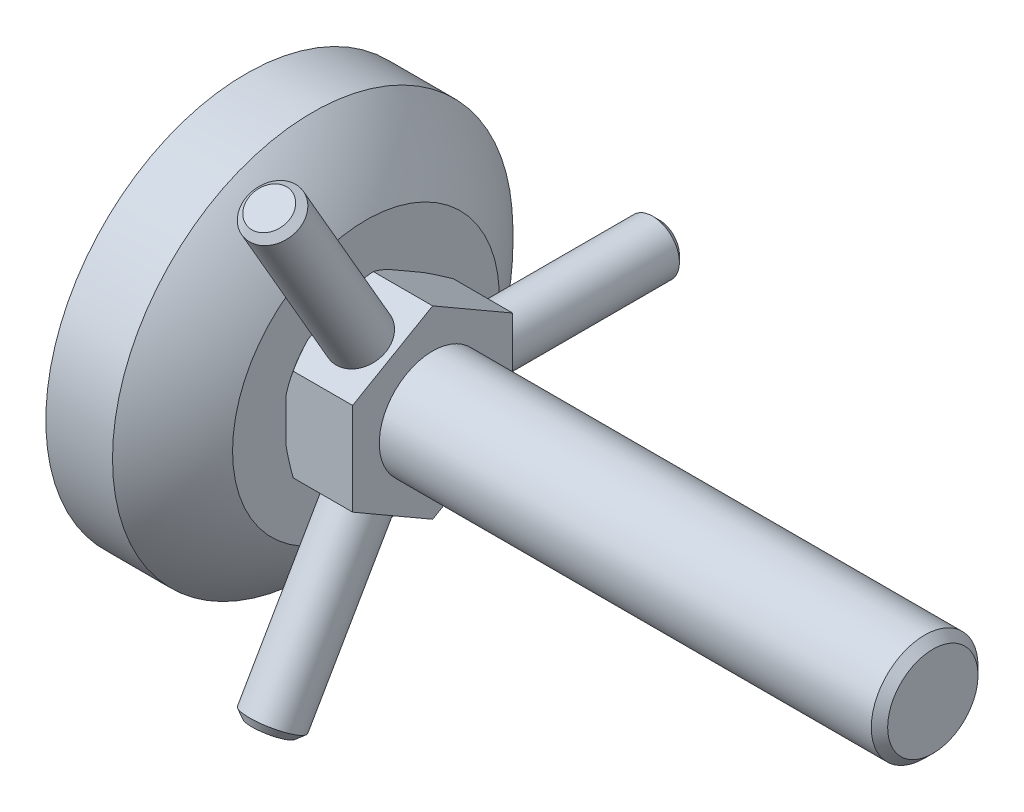
ISO-10303-21;
HEADER;
FILE_DESCRIPTION(('STEP AP214'),'2;1');
FILE_NAME('part.step','',(''),(''),'','','');
FILE_SCHEMA(('AUTOMOTIVE_DESIGN { 1 0 10303 214 1 1 1 1 }'));
ENDSEC;
DATA;
#1=APPLICATION_CONTEXT('core data for automotive mechanical design processes');
#2=APPLICATION_PROTOCOL_DEFINITION('international standard','automotive_design',2000,#1);
#3=PRODUCT_CONTEXT('',#1,'mechanical');
#4=PRODUCT('Part','Part','',(#3));
#5=PRODUCT_RELATED_PRODUCT_CATEGORY('part','',(#4));
#6=PRODUCT_DEFINITION_FORMATION('','',#4);
#7=PRODUCT_DEFINITION_CONTEXT('part definition',#1,'design');
#8=PRODUCT_DEFINITION('design','',#6,#7);
#9=PRODUCT_DEFINITION_SHAPE('','',#8);
#10=(LENGTH_UNIT() NAMED_UNIT(*) SI_UNIT(.MILLI.,.METRE.));
#11=(NAMED_UNIT(*) PLANE_ANGLE_UNIT() SI_UNIT($,.RADIAN.));
#12=(NAMED_UNIT(*) SI_UNIT($,.STERADIAN.) SOLID_ANGLE_UNIT());
#13=UNCERTAINTY_MEASURE_WITH_UNIT(LENGTH_MEASURE(1.E-05),#10,'distance_accuracy_value','');
#14=(GEOMETRIC_REPRESENTATION_CONTEXT(3) GLOBAL_UNCERTAINTY_ASSIGNED_CONTEXT((#13)) GLOBAL_UNIT_ASSIGNED_CONTEXT((#10,
#11,#12)) REPRESENTATION_CONTEXT('',''));
#15=CARTESIAN_POINT('',(0.,0.,0.));
#16=DIRECTION('',(0.,0.,1.));
#17=DIRECTION('',(1.,0.,0.));
#18=AXIS2_PLACEMENT_3D('',#15,#16,#17);
#19=CARTESIAN_POINT('',(103.,3.3865,0.));
#20=DIRECTION('',(1.,0.,0.));
#21=DIRECTION('',(0.,0.,-1.));
#22=AXIS2_PLACEMENT_3D('',#19,#20,#21);
#23=PLANE('',#22);
#24=CARTESIAN_POINT('',(103.,0.,0.));
#25=DIRECTION('',(-1.,0.,0.));
#26=DIRECTION('',(0.,0.,1.));
#27=AXIS2_PLACEMENT_3D('',#24,#25,#26);
#28=CIRCLE('',#27,6.773);
#29=CARTESIAN_POINT('',(103.,0.,6.773));
#30=VERTEX_POINT('',#29);
#31=EDGE_CURVE('E20',#30,#30,#28,.T.);
#32=ORIENTED_EDGE('',*,*,#31,.F.);
#33=EDGE_LOOP('',(#32));
#34=FACE_BOUND('',#33,.T.);
#35=ADVANCED_FACE('F17',(#34),#23,.T.);
#36=CARTESIAN_POINT('',(23.,-34.5249907475931,18.2009618943234));
#37=DIRECTION('',(0.,-0.866025403784438,0.5));
#38=DIRECTION('',(0.,-0.5,-0.866025403784438));
#39=AXIS2_PLACEMENT_3D('',#36,#37,#38);
#40=PLANE('',#39);
#41=CARTESIAN_POINT('',(23.,-33.7749907475952,19.5000000000013));
#42=DIRECTION('',(0.,0.866025403784438,-0.5));
#43=DIRECTION('',(0.,0.5,0.866025403784438));
#44=AXIS2_PLACEMENT_3D('',#41,#42,#43);
#45=CIRCLE('',#44,3.00000000002575);
#46=CARTESIAN_POINT('',(23.,-32.2749907475824,22.0980762113769));
#47=VERTEX_POINT('',#46);
#48=EDGE_CURVE('E259',#47,#47,#45,.T.);
#49=ORIENTED_EDGE('',*,*,#48,.F.);
#50=EDGE_LOOP('',(#49));
#51=FACE_BOUND('',#50,.T.);
#52=ADVANCED_FACE('F276',(#51),#40,.T.);
#53=CARTESIAN_POINT('',(23.,33.0249907475931,20.7990381056767));
#54=DIRECTION('',(0.,0.866025403784439,0.5));
#55=DIRECTION('',(0.,-0.5,0.866025403784439));
#56=AXIS2_PLACEMENT_3D('',#53,#54,#55);
#57=PLANE('',#56);
#58=CARTESIAN_POINT('',(23.,33.7749907476255,19.5000000000187));
#59=DIRECTION('',(0.,-0.866025403784438,-0.5));
#60=DIRECTION('',(0.,0.5,-0.866025403784438));
#61=AXIS2_PLACEMENT_3D('',#58,#59,#60);
#62=CIRCLE('',#61,2.99999999991639);
#63=CARTESIAN_POINT('',(23.,35.2749907475837,16.9019237887378));
#64=VERTEX_POINT('',#63);
#65=EDGE_CURVE('E256',#64,#64,#62,.T.);
#66=ORIENTED_EDGE('',*,*,#65,.F.);
#67=EDGE_LOOP('',(#66));
#68=FACE_BOUND('',#67,.T.);
#69=ADVANCED_FACE('F282',(#68),#57,.T.);
#70=CARTESIAN_POINT('',(23.,1.5,-39.));
#71=DIRECTION('',(0.,0.,-1.));
#72=DIRECTION('',(-1.,0.,0.));
#73=AXIS2_PLACEMENT_3D('',#70,#71,#72);
#74=PLANE('',#73);
#75=CARTESIAN_POINT('',(23.,0.,-38.9999999999305));
#76=DIRECTION('',(0.,0.,1.));
#77=DIRECTION('',(1.,0.,0.));
#78=AXIS2_PLACEMENT_3D('',#75,#76,#77);
#79=CIRCLE('',#78,2.99999999998591);
#80=CARTESIAN_POINT('',(25.9999999999859,0.,-38.9999999999305));
#81=VERTEX_POINT('',#80);
#82=EDGE_CURVE('E184',#81,#81,#79,.T.);
#83=ORIENTED_EDGE('',*,*,#82,.F.);
#84=EDGE_LOOP('',(#83));
#85=FACE_BOUND('',#84,.T.);
#86=ADVANCED_FACE('F540',(#85),#74,.T.);
#87=CARTESIAN_POINT('',(101.773,0.,0.));
#88=DIRECTION('',(-1.,0.,0.));
#89=DIRECTION('',(0.,0.,1.));
#90=AXIS2_PLACEMENT_3D('',#87,#88,#89);
#91=CONICAL_SURFACE('',#90,8.,0.785398163397448);
#92=CARTESIAN_POINT('',(101.773,0.,0.));
#93=DIRECTION('',(1.,0.,0.));
#94=DIRECTION('',(0.,0.,-1.));
#95=AXIS2_PLACEMENT_3D('',#92,#93,#94);
#96=CIRCLE('',#95,8.);
#97=CARTESIAN_POINT('',(101.773,0.,-8.));
#98=VERTEX_POINT('',#97);
#99=EDGE_CURVE('E181',#98,#98,#96,.F.);
#100=ORIENTED_EDGE('',*,*,#99,.F.);
#101=EDGE_LOOP('',(#100));
#102=FACE_BOUND('',#101,.T.);
#103=ORIENTED_EDGE('',*,*,#31,.T.);
#104=EDGE_LOOP('',(#103));
#105=FACE_BOUND('',#104,.T.);
#106=ADVANCED_FACE('F273',(#102,#105),#91,.T.);
#107=CARTESIAN_POINT('',(23.,-32.9089653437993,18.9999999999946));
#108=DIRECTION('',(0.,0.866025403784438,-0.5));
#109=DIRECTION('',(0.,0.5,0.866025403784438));
#110=AXIS2_PLACEMENT_3D('',#107,#108,#109);
#111=CONICAL_SURFACE('',#110,4.00000000003562,0.785398163395685);
#112=CARTESIAN_POINT('',(23.,-32.9089653438088,19.));
#113=DIRECTION('',(0.,-0.866025403784439,0.5));
#114=DIRECTION('',(0.,-0.5,-0.866025403784439));
#115=AXIS2_PLACEMENT_3D('',#112,#113,#114);
#116=CIRCLE('',#115,4.);
#117=CARTESIAN_POINT('',(23.,-30.9089653437964,22.4641016151591));
#118=VERTEX_POINT('',#117);
#119=EDGE_CURVE('E177',#118,#118,#116,.F.);
#120=CARTESIAN_POINT('',(23.,-32.2749907475824,22.0980762113769));
#121=CARTESIAN_POINT('',(23.,-32.2607613162929,22.1018889759996));
#122=CARTESIAN_POINT('',(23.,-32.2465318850035,22.1057017406223));
#123=CARTESIAN_POINT('',(23.,-32.2180730224246,22.1133272698678));
#124=CARTESIAN_POINT('',(23.,-32.2038435911352,22.1171400344905));
#125=CARTESIAN_POINT('',(23.,-32.1753847285563,22.124765563736));
#126=CARTESIAN_POINT('',(23.,-32.1611552972669,22.1285783283587));
#127=CARTESIAN_POINT('',(23.,-32.132696434688,22.1362038576042));
#128=CARTESIAN_POINT('',(23.,-32.1184670033985,22.1400166222269));
#129=CARTESIAN_POINT('',(23.,-32.0900081408197,22.1476421514724));
#130=CARTESIAN_POINT('',(23.,-32.0757787095302,22.1514549160951));
#131=CARTESIAN_POINT('',(23.,-32.0473198469514,22.1590804453406));
#132=CARTESIAN_POINT('',(23.,-32.0330904156619,22.1628932099633));
#133=CARTESIAN_POINT('',(23.,-32.0046315530831,22.1705187392088));
#134=CARTESIAN_POINT('',(23.,-31.9904021217936,22.1743315038315));
#135=CARTESIAN_POINT('',(23.,-31.9619432592147,22.181957033077));
#136=CARTESIAN_POINT('',(23.,-31.9477138279253,22.1857697976997));
#137=CARTESIAN_POINT('',(23.,-31.9192549653464,22.1933953269452));
#138=CARTESIAN_POINT('',(23.,-31.905025534057,22.1972080915679));
#139=CARTESIAN_POINT('',(23.,-31.8765666714781,22.2048336208134));
#140=CARTESIAN_POINT('',(23.,-31.8623372401887,22.2086463854361));
#141=CARTESIAN_POINT('',(23.,-31.8338783776098,22.2162719146816));
#142=CARTESIAN_POINT('',(23.,-31.8196489463204,22.2200846793043));
#143=CARTESIAN_POINT('',(23.,-31.7911900837415,22.2277102085498));
#144=CARTESIAN_POINT('',(23.,-31.7769606524521,22.2315229731725));
#145=CARTESIAN_POINT('',(23.,-31.7485017898732,22.239148502418));
#146=CARTESIAN_POINT('',(23.,-31.7342723585838,22.2429612670407));
#147=CARTESIAN_POINT('',(23.,-31.7058134960049,22.2505867962862));
#148=CARTESIAN_POINT('',(23.,-31.6915840647154,22.2543995609089));
#149=CARTESIAN_POINT('',(23.,-31.6631252021366,22.2620250901544));
#150=CARTESIAN_POINT('',(23.,-31.6488957708471,22.2658378547771));
#151=CARTESIAN_POINT('',(23.,-31.6204369082683,22.2734633840225));
#152=CARTESIAN_POINT('',(23.,-31.6062074769788,22.2772761486453));
#153=CARTESIAN_POINT('',(23.,-31.5777486143999,22.2849016778907));
#154=CARTESIAN_POINT('',(23.,-31.5635191831105,22.2887144425135));
#155=CARTESIAN_POINT('',(23.,-31.5350603205316,22.2963399717589));
#156=CARTESIAN_POINT('',(23.,-31.5208308892422,22.3001527363817));
#157=CARTESIAN_POINT('',(23.,-31.4923720266633,22.3077782656271));
#158=CARTESIAN_POINT('',(23.,-31.4781425953739,22.3115910302499));
#159=CARTESIAN_POINT('',(23.,-31.449683732795,22.3192165594953));
#160=CARTESIAN_POINT('',(23.,-31.4354543015056,22.3230293241181));
#161=CARTESIAN_POINT('',(23.,-31.4069954389267,22.3306548533635));
#162=CARTESIAN_POINT('',(23.,-31.3927660076373,22.3344676179863));
#163=CARTESIAN_POINT('',(23.,-31.3643071450584,22.3420931472317));
#164=CARTESIAN_POINT('',(23.,-31.350077713769,22.3459059118545));
#165=CARTESIAN_POINT('',(23.,-31.3216188511901,22.3535314410999));
#166=CARTESIAN_POINT('',(23.,-31.3073894199006,22.3573442057227));
#167=CARTESIAN_POINT('',(23.,-31.2789305573218,22.3649697349681));
#168=CARTESIAN_POINT('',(23.,-31.2647011260323,22.3687824995908));
#169=CARTESIAN_POINT('',(23.,-31.2362422634535,22.3764080288363));
#170=CARTESIAN_POINT('',(23.,-31.222012832164,22.380220793459));
#171=CARTESIAN_POINT('',(23.,-31.1935539695851,22.3878463227045));
#172=CARTESIAN_POINT('',(23.,-31.1793245382957,22.3916590873272));
#173=CARTESIAN_POINT('',(23.,-31.1508656757168,22.3992846165727));
#174=CARTESIAN_POINT('',(23.,-31.1366362444274,22.4030973811954));
#175=CARTESIAN_POINT('',(23.,-31.1081773818485,22.4107229104409));
#176=CARTESIAN_POINT('',(23.,-31.0939479505591,22.4145356750636));
#177=CARTESIAN_POINT('',(23.,-31.0654890879802,22.4221612043091));
#178=CARTESIAN_POINT('',(23.,-31.0512596566908,22.4259739689318));
#179=CARTESIAN_POINT('',(23.,-31.0228007941119,22.4335994981773));
#180=CARTESIAN_POINT('',(23.,-31.0085713628225,22.4374122628));
#181=CARTESIAN_POINT('',(23.,-30.9801125002436,22.4450377920455));
#182=CARTESIAN_POINT('',(23.,-30.9658830689542,22.4488505566682));
#183=CARTESIAN_POINT('',(23.,-30.9374242063753,22.4564760859137));
#184=CARTESIAN_POINT('',(23.,-30.9231947750858,22.4602888505364));
#185=CARTESIAN_POINT('',(23.,-30.9089653437964,22.4641016151591));
#186=B_SPLINE_CURVE_WITH_KNOTS('',3,(#120,#121,#122,#123,#124,#125,#126,#127,#128,#129,#130,
#131,#132,#133,#134,#135,#136,#137,#138,#139,#140,#141,#142,#143,#144,#145,#146,#147,#148,#149,
#150,#151,#152,#153,#154,#155,#156,#157,#158,#159,#160,#161,#162,#163,#164,#165,#166,#167,#168,
#169,#170,#171,#172,#173,#174,#175,#176,#177,#178,#179,#180,#181,#182,#183,#184,#185),
.UNSPECIFIED.,.F.,.F.,(4,2,2,2,2,2,2,2,2,2,2,2,2,2,2,2,2,2,2,2,2,2,2,2,2,2,2,2,2,2,2,2,4),(0.,
0.0441941738241871,0.0883883476483733,0.132582521472568,0.176776695296748,0.220970869120935,
0.265165042945128,0.309359216769309,0.353553390593496,0.39774756441769,0.441941738241877,
0.486135912066063,0.53033008589025,0.574524259714438,0.618718433538626,0.662912607362812,
0.707106781186999,0.751300955011186,0.795495128835373,0.83968930265956,0.883883476483754,
0.928077650307934,0.972271824132121,1.01646599795632,1.0606601717805,1.10485434560469,
1.14904851942887,1.19324269325306,1.23743686707725,1.28163104090143,1.32582521472562,
1.37001938854981,1.414213562374),.UNSPECIFIED.);
#187=EDGE_CURVE('BSEAM524',#47,#118,#186,.T.);
#188=ORIENTED_EDGE('',*,*,#48,.T.);
#189=ORIENTED_EDGE('',*,*,#119,.F.);
#190=ORIENTED_EDGE('',*,*,#187,.T.);
#191=ORIENTED_EDGE('',*,*,#187,.F.);
#192=EDGE_LOOP('',(#188,#190,#189,#191));
#193=FACE_BOUND('',#192,.T.);
#194=ADVANCED_FACE('F524',(#193),#111,.T.);
#195=CARTESIAN_POINT('',(23.,32.9089653438784,19.0000000000402));
#196=DIRECTION('',(0.,-0.866025403784438,-0.5));
#197=DIRECTION('',(0.,0.5,-0.866025403784438));
#198=AXIS2_PLACEMENT_3D('',#195,#196,#197);
#199=CONICAL_SURFACE('',#198,3.99999999987675,0.785398163399207);
#200=CARTESIAN_POINT('',(23.,32.9089653438087,19.));
#201=DIRECTION('',(0.,0.866025403784439,0.5));
#202=DIRECTION('',(0.,-0.5,0.866025403784439));
#203=AXIS2_PLACEMENT_3D('',#200,#201,#202);
#204=CIRCLE('',#203,4.);
#205=CARTESIAN_POINT('',(23.,34.9089653437874,15.5358983848992));
#206=VERTEX_POINT('',#205);
#207=EDGE_CURVE('E173',#206,#206,#204,.F.);
#208=CARTESIAN_POINT('',(23.,35.2749907475837,16.9019237887378));
#209=CARTESIAN_POINT('',(23.,35.2711779829608,16.8876943574478));
#210=CARTESIAN_POINT('',(23.,35.267365218338,16.8734649261578));
#211=CARTESIAN_POINT('',(23.,35.2597396890922,16.8450060635778));
#212=CARTESIAN_POINT('',(23.,35.2559269244693,16.8307766322878));
#213=CARTESIAN_POINT('',(23.,35.2483013952236,16.8023177697079));
#214=CARTESIAN_POINT('',(23.,35.2444886306007,16.7880883384179));
#215=CARTESIAN_POINT('',(23.,35.2368631013549,16.7596294758379));
#216=CARTESIAN_POINT('',(23.,35.233050336732,16.7454000445479));
#217=CARTESIAN_POINT('',(23.,35.2254248074863,16.716941181968));
#218=CARTESIAN_POINT('',(23.,35.2216120428634,16.702711750678));
#219=CARTESIAN_POINT('',(23.,35.2139865136177,16.674252888098));
#220=CARTESIAN_POINT('',(23.,35.2101737489948,16.660023456808));
#221=CARTESIAN_POINT('',(23.,35.202548219749,16.6315645942281));
#222=CARTESIAN_POINT('',(23.,35.1987354551261,16.6173351629381));
#223=CARTESIAN_POINT('',(23.,35.1911099258804,16.5888763003581));
#224=CARTESIAN_POINT('',(23.,35.1872971612575,16.5746468690681));
#225=CARTESIAN_POINT('',(23.,35.1796716320117,16.5461880064882));
#226=CARTESIAN_POINT('',(23.,35.1758588673889,16.5319585751982));
#227=CARTESIAN_POINT('',(23.,35.1682333381431,16.5034997126182));
#228=CARTESIAN_POINT('',(23.,35.1644205735202,16.4892702813282));
#229=CARTESIAN_POINT('',(23.,35.1567950442745,16.4608114187482));
#230=CARTESIAN_POINT('',(23.,35.1529822796516,16.4465819874583));
#231=CARTESIAN_POINT('',(23.,35.1453567504058,16.4181231248783));
#232=CARTESIAN_POINT('',(23.,35.141543985783,16.4038936935883));
#233=CARTESIAN_POINT('',(23.,35.1339184565372,16.3754348310083));
#234=CARTESIAN_POINT('',(23.,35.1301056919143,16.3612053997183));
#235=CARTESIAN_POINT('',(23.,35.1224801626686,16.3327465371384));
#236=CARTESIAN_POINT('',(23.,35.1186673980457,16.3185171058484));
#237=CARTESIAN_POINT('',(23.,35.1110418687999,16.2900582432684));
#238=CARTESIAN_POINT('',(23.,35.107229104177,16.2758288119784));
#239=CARTESIAN_POINT('',(23.,35.0996035749313,16.2473699493985));
#240=CARTESIAN_POINT('',(23.,35.0957908103084,16.2331405181085));
#241=CARTESIAN_POINT('',(23.,35.0881652810627,16.2046816555285));
#242=CARTESIAN_POINT('',(23.,35.0843525164398,16.1904522242385));
#243=CARTESIAN_POINT('',(23.,35.076726987194,16.1619933616586));
#244=CARTESIAN_POINT('',(23.,35.0729142225711,16.1477639303686));
#245=CARTESIAN_POINT('',(23.,35.0652886933254,16.1193050677886));
#246=CARTESIAN_POINT('',(23.,35.0614759287025,16.1050756364986));
#247=CARTESIAN_POINT('',(23.,35.0538503994567,16.0766167739187));
#248=CARTESIAN_POINT('',(23.,35.0500376348339,16.0623873426287));
#249=CARTESIAN_POINT('',(23.,35.0424121055881,16.0339284800487));
#250=CARTESIAN_POINT('',(23.,35.0385993409652,16.0196990487587));
#251=CARTESIAN_POINT('',(23.,35.0309738117195,15.9912401861787));
#252=CARTESIAN_POINT('',(23.,35.0271610470966,15.9770107548888));
#253=CARTESIAN_POINT('',(23.,35.0195355178508,15.9485518923088));
#254=CARTESIAN_POINT('',(23.,35.015722753228,15.9343224610188));
#255=CARTESIAN_POINT('',(23.,35.0080972239822,15.9058635984388));
#256=CARTESIAN_POINT('',(23.,35.0042844593593,15.8916341671488));
#257=CARTESIAN_POINT('',(23.,34.9966589301136,15.8631753045689));
#258=CARTESIAN_POINT('',(23.,34.9928461654907,15.8489458732789));
#259=CARTESIAN_POINT('',(23.,34.9852206362449,15.8204870106989));
#260=CARTESIAN_POINT('',(23.,34.981407871622,15.8062575794089));
#261=CARTESIAN_POINT('',(23.,34.9737823423763,15.777798716829));
#262=CARTESIAN_POINT('',(23.,34.9699695777534,15.763569285539));
#263=CARTESIAN_POINT('',(23.,34.9623440485077,15.735110422959));
#264=CARTESIAN_POINT('',(23.,34.9585312838848,15.720880991669));
#265=CARTESIAN_POINT('',(23.,34.950905754639,15.6924221290891));
#266=CARTESIAN_POINT('',(23.,34.9470929900161,15.6781926977991));
#267=CARTESIAN_POINT('',(23.,34.9394674607704,15.6497338352191));
#268=CARTESIAN_POINT('',(23.,34.9356546961475,15.6355044039291));
#269=CARTESIAN_POINT('',(23.,34.9280291669017,15.6070455413491));
#270=CARTESIAN_POINT('',(23.,34.9242164022789,15.5928161100592));
#271=CARTESIAN_POINT('',(23.,34.9165908730331,15.5643572474792));
#272=CARTESIAN_POINT('',(23.,34.9127781084102,15.5501278161892));
#273=CARTESIAN_POINT('',(23.,34.9089653437874,15.5358983848992));
#274=B_SPLINE_CURVE_WITH_KNOTS('',3,(#208,#209,#210,#211,#212,#213,#214,#215,#216,#217,#218,
#219,#220,#221,#222,#223,#224,#225,#226,#227,#228,#229,#230,#231,#232,#233,#234,#235,#236,#237,
#238,#239,#240,#241,#242,#243,#244,#245,#246,#247,#248,#249,#250,#251,#252,#253,#254,#255,#256,
#257,#258,#259,#260,#261,#262,#263,#264,#265,#266,#267,#268,#269,#270,#271,#272,#273),
.UNSPECIFIED.,.F.,.F.,(4,2,2,2,2,2,2,2,2,2,2,2,2,2,2,2,2,2,2,2,2,2,2,2,2,2,2,2,2,2,2,2,4),(0.,
0.0441941738258921,0.0883883476517793,0.132582521477668,0.176776695303559,0.220970869129442,
0.265165042955333,0.309359216781223,0.353553390607112,0.397747564433003,0.441941738258891,
0.48613591208478,0.530330085910667,0.574524259736558,0.618718433562445,0.662912607388335,
0.707106781214226,0.751300955040115,0.795495128866,0.839689302691891,0.883883476517779,
0.92807765034367,0.97227182416956,1.01646599799545,1.06066017182133,1.10485434564723,
1.14904851947311,1.193242693299,1.23743686712489,1.28163104095078,1.32582521477667,
1.37001938860256,1.41421356242845),.UNSPECIFIED.);
#275=EDGE_CURVE('BSEAM515',#64,#206,#274,.T.);
#276=ORIENTED_EDGE('',*,*,#65,.T.);
#277=ORIENTED_EDGE('',*,*,#207,.F.);
#278=ORIENTED_EDGE('',*,*,#275,.T.);
#279=ORIENTED_EDGE('',*,*,#275,.F.);
#280=EDGE_LOOP('',(#276,#278,#277,#279));
#281=FACE_BOUND('',#280,.T.);
#282=ADVANCED_FACE('F515',(#281),#199,.T.);
#283=CARTESIAN_POINT('',(23.,0.,-37.999999999954));
#284=DIRECTION('',(0.,0.,1.));
#285=DIRECTION('',(1.,0.,0.));
#286=AXIS2_PLACEMENT_3D('',#283,#284,#285);
#287=CONICAL_SURFACE('',#286,3.99999999996226,0.785398163397448);
#288=ORIENTED_EDGE('',*,*,#82,.T.);
#289=EDGE_LOOP('',(#288));
#290=FACE_BOUND('',#289,.T.);
#291=CARTESIAN_POINT('',(23.,0.,-38.));
#292=DIRECTION('',(0.,0.,-1.));
#293=DIRECTION('',(-1.,0.,0.));
#294=AXIS2_PLACEMENT_3D('',#291,#292,#293);
#295=CIRCLE('',#294,4.);
#296=CARTESIAN_POINT('',(19.,0.,-38.));
#297=VERTEX_POINT('',#296);
#298=EDGE_CURVE('E170',#297,#297,#295,.F.);
#299=ORIENTED_EDGE('',*,*,#298,.F.);
#300=EDGE_LOOP('',(#299));
#301=FACE_BOUND('',#300,.T.);
#302=ADVANCED_FACE('F506',(#290,#301),#287,.T.);
#303=CARTESIAN_POINT('',(64.8865,0.,0.));
#304=DIRECTION('',(1.,0.,0.));
#305=DIRECTION('',(0.,0.,-1.));
#306=AXIS2_PLACEMENT_3D('',#303,#304,#305);
#307=CYLINDRICAL_SURFACE('',#306,8.);
#308=CARTESIAN_POINT('',(28.,0.,0.));
#309=DIRECTION('',(1.,0.,0.));
#310=DIRECTION('',(0.,0.,-1.));
#311=AXIS2_PLACEMENT_3D('',#308,#309,#310);
#312=CIRCLE('',#311,8.);
#313=CARTESIAN_POINT('',(28.,0.,-8.));
#314=VERTEX_POINT('',#313);
#315=EDGE_CURVE('E126',#314,#314,#312,.F.);
#316=ORIENTED_EDGE('',*,*,#315,.F.);
#317=EDGE_LOOP('',(#316));
#318=FACE_BOUND('',#317,.T.);
#319=ORIENTED_EDGE('',*,*,#99,.T.);
#320=EDGE_LOOP('',(#319));
#321=FACE_BOUND('',#320,.T.);
#322=ADVANCED_FACE('F497',(#318,#321),#307,.T.);
#323=CARTESIAN_POINT('',(23.,-21.650635094611,12.5));
#324=DIRECTION('',(0.,-0.866025403784439,0.5));
#325=DIRECTION('',(0.,-0.5,-0.866025403784439));
#326=AXIS2_PLACEMENT_3D('',#323,#324,#325);
#327=CYLINDRICAL_SURFACE('',#326,4.);
#328=ORIENTED_EDGE('',*,*,#119,.T.);
#329=EDGE_LOOP('',(#328));
#330=FACE_BOUND('',#329,.T.);
#331=CARTESIAN_POINT('',(23.,-10.3923048454133,6.));
#332=DIRECTION('',(0.,-0.866025403784439,0.5));
#333=DIRECTION('',(0.,-0.5,-0.866025403784439));
#334=AXIS2_PLACEMENT_3D('',#331,#332,#333);
#335=CIRCLE('',#334,4.);
#336=CARTESIAN_POINT('',(23.,-12.3923048454133,2.53589838486224));
#337=VERTEX_POINT('',#336);
#338=EDGE_CURVE('E117',#337,#337,#335,.T.);
#339=ORIENTED_EDGE('',*,*,#338,.T.);
#340=EDGE_LOOP('',(#339));
#341=FACE_BOUND('',#340,.T.);
#342=ADVANCED_FACE('F488',(#330,#341),#327,.T.);
#343=CARTESIAN_POINT('',(23.,21.650635094611,12.5));
#344=DIRECTION('',(0.,0.866025403784439,0.5));
#345=DIRECTION('',(0.,-0.5,0.866025403784439));
#346=AXIS2_PLACEMENT_3D('',#343,#344,#345);
#347=CYLINDRICAL_SURFACE('',#346,4.);
#348=ORIENTED_EDGE('',*,*,#207,.T.);
#349=EDGE_LOOP('',(#348));
#350=FACE_BOUND('',#349,.T.);
#351=CARTESIAN_POINT('',(23.,10.3923048454133,6.));
#352=DIRECTION('',(0.,0.866025403784439,0.5));
#353=DIRECTION('',(0.,-0.5,0.866025403784439));
#354=AXIS2_PLACEMENT_3D('',#351,#352,#353);
#355=CIRCLE('',#354,4.);
#356=CARTESIAN_POINT('',(23.,8.3923048454133,9.46410161513776));
#357=VERTEX_POINT('',#356);
#358=EDGE_CURVE('E161',#357,#357,#355,.T.);
#359=ORIENTED_EDGE('',*,*,#358,.T.);
#360=EDGE_LOOP('',(#359));
#361=FACE_BOUND('',#360,.T.);
#362=ADVANCED_FACE('F480',(#350,#361),#347,.T.);
#363=CARTESIAN_POINT('',(23.,0.,-25.));
#364=DIRECTION('',(0.,0.,-1.));
#365=DIRECTION('',(-1.,0.,0.));
#366=AXIS2_PLACEMENT_3D('',#363,#364,#365);
#367=CYLINDRICAL_SURFACE('',#366,4.);
#368=ORIENTED_EDGE('',*,*,#298,.T.);
#369=EDGE_LOOP('',(#368));
#370=FACE_BOUND('',#369,.T.);
#371=CARTESIAN_POINT('',(23.,0.,-12.));
#372=DIRECTION('',(0.,0.,-1.));
#373=DIRECTION('',(-1.,0.,0.));
#374=AXIS2_PLACEMENT_3D('',#371,#372,#373);
#375=CIRCLE('',#374,4.);
#376=CARTESIAN_POINT('',(19.,0.,-12.));
#377=VERTEX_POINT('',#376);
#378=EDGE_CURVE('E323',#377,#377,#375,.T.);
#379=ORIENTED_EDGE('',*,*,#378,.T.);
#380=EDGE_LOOP('',(#379));
#381=FACE_BOUND('',#380,.T.);
#382=ADVANCED_FACE('F472',(#370,#381),#367,.T.);
#383=CARTESIAN_POINT('',(28.,11.2,0.));
#384=DIRECTION('',(1.,0.,0.));
#385=DIRECTION('',(0.,0.,-1.));
#386=AXIS2_PLACEMENT_3D('',#383,#384,#385);
#387=PLANE('',#386);
#388=ORIENTED_EDGE('',*,*,#315,.T.);
#389=EDGE_LOOP('',(#388));
#390=FACE_BOUND('',#389,.T.);
#391=DIRECTION('',(0.,-0.5,0.866025403784439));
#392=VECTOR('',#391,1.);
#393=CARTESIAN_POINT('',(28.,-6.92820323027551,-12.));
#394=LINE('',#393,#392);
#395=CARTESIAN_POINT('',(28.,-13.856406460551,0.));
#396=VERTEX_POINT('',#395);
#397=CARTESIAN_POINT('',(28.,-6.92820323027551,-12.));
#398=VERTEX_POINT('',#397);
#399=EDGE_CURVE('E102',#396,#398,#394,.F.);
#400=ORIENTED_EDGE('',*,*,#399,.T.);
#401=DIRECTION('',(0.,1.,0.));
#402=VECTOR('',#401,1.);
#403=CARTESIAN_POINT('',(28.,6.92820323027551,-12.));
#404=LINE('',#403,#402);
#405=CARTESIAN_POINT('',(28.,6.92820323027551,-12.));
#406=VERTEX_POINT('',#405);
#407=EDGE_CURVE('E149',#398,#406,#404,.T.);
#408=ORIENTED_EDGE('',*,*,#407,.T.);
#409=DIRECTION('',(0.,-0.5,-0.866025403784439));
#410=VECTOR('',#409,1.);
#411=CARTESIAN_POINT('',(28.,13.856406460551,0.));
#412=LINE('',#411,#410);
#413=CARTESIAN_POINT('',(28.,13.856406460551,0.));
#414=VERTEX_POINT('',#413);
#415=EDGE_CURVE('E141',#406,#414,#412,.F.);
#416=ORIENTED_EDGE('',*,*,#415,.T.);
#417=DIRECTION('',(0.,0.5,-0.866025403784439));
#418=VECTOR('',#417,1.);
#419=CARTESIAN_POINT('',(28.,6.92820323027551,12.));
#420=LINE('',#419,#418);
#421=CARTESIAN_POINT('',(28.,6.92820323027551,12.));
#422=VERTEX_POINT('',#421);
#423=EDGE_CURVE('E157',#414,#422,#420,.F.);
#424=ORIENTED_EDGE('',*,*,#423,.T.);
#425=DIRECTION('',(0.,1.,0.));
#426=VECTOR('',#425,1.);
#427=CARTESIAN_POINT('',(28.,-6.92820323027551,12.));
#428=LINE('',#427,#426);
#429=CARTESIAN_POINT('',(28.,-6.92820323027551,12.));
#430=VERTEX_POINT('',#429);
#431=EDGE_CURVE('E112',#422,#430,#428,.F.);
#432=ORIENTED_EDGE('',*,*,#431,.T.);
#433=DIRECTION('',(0.,0.5,0.866025403784439));
#434=VECTOR('',#433,1.);
#435=CARTESIAN_POINT('',(28.,-13.856406460551,0.));
#436=LINE('',#435,#434);
#437=EDGE_CURVE('E108',#430,#396,#436,.F.);
#438=ORIENTED_EDGE('',*,*,#437,.T.);
#439=EDGE_LOOP('',(#400,#408,#416,#424,#432,#438));
#440=FACE_BOUND('',#439,.T.);
#441=ADVANCED_FACE('F109',(#390,#440),#387,.T.);
#442=CARTESIAN_POINT('',(19.0988586744857,0.,0.));
#443=DIRECTION('',(1.,0.,0.));
#444=DIRECTION('',(0.,0.,-1.));
#445=AXIS2_PLACEMENT_3D('',#442,#443,#444);
#446=CONICAL_SURFACE('',#445,13.8651448993143,0.927295218001612);
#447=CARTESIAN_POINT('',(19.0923048454132,-6.9282032302755,-12.));
#448=CARTESIAN_POINT('',(18.9762996114634,-7.08290575339472,-11.7320473698984));
#449=CARTESIAN_POINT('',(18.865345585772,-7.2385889215827,-11.4623962127136));
#450=CARTESIAN_POINT('',(18.6554927425294,-7.55164804758858,-10.9201619006983));
#451=CARTESIAN_POINT('',(18.5565720420488,-7.70902034860734,-10.6475850796298));
#452=CARTESIAN_POINT('',(18.3722679792387,-8.02581079784772,-10.0988879261928));
#453=CARTESIAN_POINT('',(18.2868889311364,-8.18522958064172,-9.82276649471285));
#454=CARTESIAN_POINT('',(18.1314258899954,-8.50622597765644,-9.2667844260368));
#455=CARTESIAN_POINT('',(18.0613704919612,-8.66780704080228,-8.98691781512722));
#456=CARTESIAN_POINT('',(18.,-8.83025491023194,-8.70554985169372));
#457=B_SPLINE_CURVE_WITH_KNOTS('',3,(#447,#448,#449,#450,#451,#452,#453,#454,#455,#456),
.UNSPECIFIED.,.F.,.F.,(4,2,2,2,4),(0.,0.99135882869546,1.98088700330507,2.9707298006179,
3.96240424732748),.UNSPECIFIED.);
#458=CARTESIAN_POINT('',(19.0923048454132,-6.92820323027551,-12.));
#459=VERTEX_POINT('',#458);
#460=CARTESIAN_POINT('',(18.,-8.83025491023194,-8.70554985169373));
#461=VERTEX_POINT('',#460);
#462=EDGE_CURVE('E94',#459,#461,#457,.T.);
#463=ORIENTED_EDGE('',*,*,#462,.T.);
#464=CARTESIAN_POINT('',(18.,0.,0.));
#465=DIRECTION('',(1.,0.,0.));
#466=DIRECTION('',(0.,0.,-1.));
#467=AXIS2_PLACEMENT_3D('',#464,#465,#466);
#468=CIRCLE('',#467,12.4);
#469=CARTESIAN_POINT('',(18.,-3.12409987036267,-12.));
#470=VERTEX_POINT('',#469);
#471=EDGE_CURVE('E211',#470,#461,#468,.F.);
#472=ORIENTED_EDGE('',*,*,#471,.F.);
#473=CARTESIAN_POINT('',(18.,-3.12409987036265,-12.));
#474=CARTESIAN_POINT('',(18.0613704919612,-3.44899560922199,-12.));
#475=CARTESIAN_POINT('',(18.1314258899954,-3.77215773551365,-12.));
#476=CARTESIAN_POINT('',(18.2868889311364,-4.4141505295431,-12.));
#477=CARTESIAN_POINT('',(18.3722679792387,-4.7329880951311,-12.));
#478=CARTESIAN_POINT('',(18.5565720420488,-5.36656899361187,-12.));
#479=CARTESIAN_POINT('',(18.6554927425294,-5.68131359564937,-12.));
#480=CARTESIAN_POINT('',(18.865345585772,-6.30743184766113,-12.));
#481=CARTESIAN_POINT('',(18.9762996114634,-6.61879818403708,-12.));
#482=CARTESIAN_POINT('',(19.0923048454132,-6.92820323027552,-12.));
#483=B_SPLINE_CURVE_WITH_KNOTS('',3,(#473,#474,#475,#476,#477,#478,#479,#480,#481,#482),
.UNSPECIFIED.,.F.,.F.,(4,2,2,2,4),(0.,0.991674446709577,1.98151724402242,2.97104541863202,
3.96240424732748),.UNSPECIFIED.);
#484=EDGE_CURVE('E214',#470,#459,#483,.T.);
#485=ORIENTED_EDGE('',*,*,#484,.T.);
#486=EDGE_LOOP('',(#463,#472,#485));
#487=FACE_BOUND('',#486,.T.);
#488=ADVANCED_FACE('F229',(#487),#446,.T.);
#489=CARTESIAN_POINT('',(28.,-6.92820323027551,-12.));
#490=DIRECTION('',(0.,0.866025403784439,0.5));
#491=DIRECTION('',(0.,-0.5,0.866025403784439));
#492=AXIS2_PLACEMENT_3D('',#489,#490,#491);
#493=PLANE('',#492);
#494=DIRECTION('',(1.,0.,0.));
#495=VECTOR('',#494,1.);
#496=CARTESIAN_POINT('',(28.,-6.92820323027551,-12.));
#497=LINE('',#496,#495);
#498=EDGE_CURVE('E124',#459,#398,#497,.T.);
#499=ORIENTED_EDGE('',*,*,#498,.T.);
#500=ORIENTED_EDGE('',*,*,#399,.F.);
#501=DIRECTION('',(1.,0.,0.));
#502=VECTOR('',#501,1.);
#503=CARTESIAN_POINT('',(28.,-13.856406460551,0.));
#504=LINE('',#503,#502);
#505=CARTESIAN_POINT('',(19.0923048454132,-13.856406460551,0.));
#506=VERTEX_POINT('',#505);
#507=EDGE_CURVE('E116',#396,#506,#504,.F.);
#508=ORIENTED_EDGE('',*,*,#507,.T.);
#509=CARTESIAN_POINT('',(18.,-11.9543547805946,-3.29445014830626));
#510=CARTESIAN_POINT('',(18.0613704919612,-12.1168026500243,-3.01308218487277));
#511=CARTESIAN_POINT('',(18.1314258899955,-12.2783837131701,-2.73321557396319));
#512=CARTESIAN_POINT('',(18.2868889311365,-12.5993801101848,-2.17723350528714));
#513=CARTESIAN_POINT('',(18.3722679792387,-12.7587988929788,-1.90111207380715));
#514=CARTESIAN_POINT('',(18.5565720420488,-13.0755893422192,-1.35241492037024));
#515=CARTESIAN_POINT('',(18.6554927425294,-13.2329616432379,-1.07983809930174));
#516=CARTESIAN_POINT('',(18.865345585772,-13.5460207692438,-0.537603787286449));
#517=CARTESIAN_POINT('',(18.9762996114634,-13.7017039374318,-0.267952630101581));
#518=CARTESIAN_POINT('',(19.0923048454132,-13.856406460551,0.));
#519=B_SPLINE_CURVE_WITH_KNOTS('',3,(#509,#510,#511,#512,#513,#514,#515,#516,#517,#518),
.UNSPECIFIED.,.F.,.F.,(4,2,2,2,4),(0.,0.991674446709571,1.98151724402241,2.97104541863201,
3.96240424732746),.UNSPECIFIED.);
#520=CARTESIAN_POINT('',(18.,-11.9543547805946,-3.29445014830627));
#521=VERTEX_POINT('',#520);
#522=EDGE_CURVE('E245',#521,#506,#519,.T.);
#523=ORIENTED_EDGE('',*,*,#522,.F.);
#524=DIRECTION('',(0.,-0.5,0.866025403784438));
#525=VECTOR('',#524,1.);
#526=CARTESIAN_POINT('',(18.,-8.83025491023194,-8.70554985169373));
#527=LINE('',#526,#525);
#528=EDGE_CURVE('E210',#461,#521,#527,.T.);
#529=ORIENTED_EDGE('',*,*,#528,.F.);
#530=ORIENTED_EDGE('',*,*,#462,.F.);
#531=EDGE_LOOP('',(#499,#500,#508,#523,#529,#530));
#532=FACE_BOUND('',#531,.T.);
#533=ADVANCED_FACE('F120',(#532),#493,.F.);
#534=CARTESIAN_POINT('',(19.0988586744857,0.,0.));
#535=DIRECTION('',(1.,0.,0.));
#536=DIRECTION('',(0.,0.,-1.));
#537=AXIS2_PLACEMENT_3D('',#534,#535,#536);
#538=CONICAL_SURFACE('',#537,13.8651448993143,0.927295218001612);
#539=CARTESIAN_POINT('',(19.0923048454132,-13.856406460551,0.));
#540=CARTESIAN_POINT('',(18.9762996114634,-13.7017039374318,0.267952630101574));
#541=CARTESIAN_POINT('',(18.865345585772,-13.5460207692438,0.53760378728644));
#542=CARTESIAN_POINT('',(18.6554927425294,-13.2329616432379,1.07983809930173));
#543=CARTESIAN_POINT('',(18.5565720420488,-13.0755893422192,1.35241492037023));
#544=CARTESIAN_POINT('',(18.3722679792387,-12.7587988929788,1.90111207380714));
#545=CARTESIAN_POINT('',(18.2868889311364,-12.5993801101848,2.17723350528713));
#546=CARTESIAN_POINT('',(18.1314258899954,-12.2783837131701,2.73321557396318));
#547=CARTESIAN_POINT('',(18.0613704919612,-12.1168026500242,3.01308218487276));
#548=CARTESIAN_POINT('',(18.,-11.9543547805946,3.29445014830625));
#549=B_SPLINE_CURVE_WITH_KNOTS('',3,(#539,#540,#541,#542,#543,#544,#545,#546,#547,#548),
.UNSPECIFIED.,.F.,.F.,(4,2,2,2,4),(0.,0.991358828695455,1.98088700330506,2.97072980061789,
3.96240424732746),.UNSPECIFIED.);
#550=CARTESIAN_POINT('',(18.,-11.9543547805946,3.29445014830626));
#551=VERTEX_POINT('',#550);
#552=EDGE_CURVE('E131',#506,#551,#549,.T.);
#553=ORIENTED_EDGE('',*,*,#552,.T.);
#554=CARTESIAN_POINT('',(18.,0.,0.));
#555=DIRECTION('',(1.,0.,0.));
#556=DIRECTION('',(0.,0.,-1.));
#557=AXIS2_PLACEMENT_3D('',#554,#555,#556);
#558=CIRCLE('',#557,12.4);
#559=EDGE_CURVE('E207',#521,#551,#558,.F.);
#560=ORIENTED_EDGE('',*,*,#559,.F.);
#561=ORIENTED_EDGE('',*,*,#522,.T.);
#562=EDGE_LOOP('',(#553,#560,#561));
#563=FACE_BOUND('',#562,.T.);
#564=ADVANCED_FACE('F371',(#563),#538,.T.);
#565=CARTESIAN_POINT('',(28.,-13.856406460551,0.));
#566=DIRECTION('',(0.,0.866025403784439,-0.5));
#567=DIRECTION('',(0.,0.5,0.866025403784439));
#568=AXIS2_PLACEMENT_3D('',#565,#566,#567);
#569=PLANE('',#568);
#570=ORIENTED_EDGE('',*,*,#507,.F.);
#571=ORIENTED_EDGE('',*,*,#437,.F.);
#572=DIRECTION('',(-1.,0.,0.));
#573=VECTOR('',#572,1.);
#574=CARTESIAN_POINT('',(28.,-6.92820323027551,12.));
#575=LINE('',#574,#573);
#576=CARTESIAN_POINT('',(19.0923048304108,-6.92820325027872,11.9999999653534));
#577=VERTEX_POINT('',#576);
#578=EDGE_CURVE('E165',#430,#577,#575,.T.);
#579=ORIENTED_EDGE('',*,*,#578,.T.);
#580=CARTESIAN_POINT('',(18.,-8.83025491023193,8.70554985169372));
#581=CARTESIAN_POINT('',(18.0613704906354,-8.66780704431367,8.98691780904528));
#582=CARTESIAN_POINT('',(18.1314258869684,-8.5062259846398,9.26678441394124));
#583=CARTESIAN_POINT('',(18.286888924086,-8.18522959446877,9.82276647076366));
#584=CARTESIAN_POINT('',(18.3722679698683,-8.02581081504676,10.0988878964032));
#585=CARTESIAN_POINT('',(18.5565720275365,-7.70902037245756,10.6475850383199));
#586=CARTESIAN_POINT('',(18.6554927251955,-7.55164807471806,10.9201618537086));
#587=CARTESIAN_POINT('',(18.8653455623838,-7.23858895520367,11.4623961544803));
#588=CARTESIAN_POINT('',(18.976299584841,-7.08290579022765,11.7320473061019));
#589=CARTESIAN_POINT('',(19.0923048154085,-6.92820327028193,11.9999999307068));
#590=B_SPLINE_CURVE_WITH_KNOTS('',3,(#580,#581,#582,#583,#584,#585,#586,#587,#588,#589),
.UNSPECIFIED.,.F.,.F.,(4,2,2,2,4),(0.,0.991674425287866,1.98151720127885,2.97104535459185,
3.96240416189098),.UNSPECIFIED.);
#591=CARTESIAN_POINT('',(18.,-8.83025491023193,8.70554985169373));
#592=VERTEX_POINT('',#591);
#593=EDGE_CURVE('E133',#592,#577,#590,.T.);
#594=ORIENTED_EDGE('',*,*,#593,.F.);
#595=DIRECTION('',(0.,0.5,0.866025403784439));
#596=VECTOR('',#595,1.);
#597=CARTESIAN_POINT('',(18.,-11.9543547805946,3.29445014830626));
#598=LINE('',#597,#596);
#599=EDGE_CURVE('E206',#551,#592,#598,.T.);
#600=ORIENTED_EDGE('',*,*,#599,.F.);
#601=ORIENTED_EDGE('',*,*,#552,.F.);
#602=EDGE_LOOP('',(#570,#571,#579,#594,#600,#601));
#603=FACE_BOUND('',#602,.T.);
#604=ORIENTED_EDGE('',*,*,#338,.F.);
#605=EDGE_LOOP('',(#604));
#606=FACE_BOUND('',#605,.T.);
#607=ADVANCED_FACE('F128',(#603,#606),#569,.F.);
#608=CARTESIAN_POINT('',(19.0988586744857,0.,0.));
#609=DIRECTION('',(1.,0.,0.));
#610=DIRECTION('',(0.,0.,-1.));
#611=AXIS2_PLACEMENT_3D('',#608,#609,#610);
#612=CONICAL_SURFACE('',#611,13.8651448993143,0.927295218001612);
#613=CARTESIAN_POINT('',(19.092304854867,-6.92820325548567,12.));
#614=CARTESIAN_POINT('',(18.9762996198514,-6.61879820724744,12.));
#615=CARTESIAN_POINT('',(18.865345593141,-6.30743186884747,12.));
#616=CARTESIAN_POINT('',(18.6554927479909,-5.68131361274509,12.));
#617=CARTESIAN_POINT('',(18.5565720466213,-5.36656900864115,12.));
#618=CARTESIAN_POINT('',(18.3722679821911,-4.73298810596913,12.));
#619=CARTESIAN_POINT('',(18.2868889333579,-4.41415053825626,12.));
#620=CARTESIAN_POINT('',(18.1314258909492,-3.77215773991425,12.));
#621=CARTESIAN_POINT('',(18.0613704923789,-3.44899561143471,12.));
#622=CARTESIAN_POINT('',(18.,-3.12409987036265,12.));
#623=B_SPLINE_CURVE_WITH_KNOTS('',3,(#613,#614,#615,#616,#617,#618,#619,#620,#621,#622),
.UNSPECIFIED.,.F.,.F.,(4,2,2,2,4),(0.,0.991358835436931,1.98088701675659,2.97072982078744,
3.96240427424649),.UNSPECIFIED.);
#624=CARTESIAN_POINT('',(18.,-3.12409987036267,12.));
#625=VERTEX_POINT('',#624);
#626=EDGE_CURVE('E335',#577,#625,#623,.T.);
#627=ORIENTED_EDGE('',*,*,#626,.T.);
#628=CARTESIAN_POINT('',(18.,0.,0.));
#629=DIRECTION('',(1.,0.,0.));
#630=DIRECTION('',(0.,0.,-1.));
#631=AXIS2_PLACEMENT_3D('',#628,#629,#630);
#632=CIRCLE('',#631,12.4);
#633=EDGE_CURVE('E203',#592,#625,#632,.F.);
#634=ORIENTED_EDGE('',*,*,#633,.F.);
#635=ORIENTED_EDGE('',*,*,#593,.T.);
#636=EDGE_LOOP('',(#627,#634,#635));
#637=FACE_BOUND('',#636,.T.);
#638=ADVANCED_FACE('F365',(#637),#612,.T.);
#639=CARTESIAN_POINT('',(28.,-6.92820323027551,12.));
#640=DIRECTION('',(0.,0.,-1.));
#641=DIRECTION('',(-1.,0.,0.));
#642=AXIS2_PLACEMENT_3D('',#639,#640,#641);
#643=PLANE('',#642);
#644=ORIENTED_EDGE('',*,*,#578,.F.);
#645=ORIENTED_EDGE('',*,*,#431,.F.);
#646=DIRECTION('',(1.,0.,0.));
#647=VECTOR('',#646,1.);
#648=CARTESIAN_POINT('',(28.,6.92820323027551,12.));
#649=LINE('',#648,#647);
#650=CARTESIAN_POINT('',(19.0923048454132,6.92820323027552,12.));
#651=VERTEX_POINT('',#650);
#652=EDGE_CURVE('E160',#422,#651,#649,.F.);
#653=ORIENTED_EDGE('',*,*,#652,.T.);
#654=CARTESIAN_POINT('',(18.,3.12409987036265,12.));
#655=CARTESIAN_POINT('',(18.0613704919612,3.44899560922199,12.));
#656=CARTESIAN_POINT('',(18.1314258899954,3.77215773551365,12.));
#657=CARTESIAN_POINT('',(18.2868889311364,4.4141505295431,12.));
#658=CARTESIAN_POINT('',(18.3722679792387,4.7329880951311,12.));
#659=CARTESIAN_POINT('',(18.5565720420488,5.36656899361187,12.));
#660=CARTESIAN_POINT('',(18.6554927425294,5.68131359564937,12.));
#661=CARTESIAN_POINT('',(18.865345585772,6.30743184766113,12.));
#662=CARTESIAN_POINT('',(18.9762996114634,6.61879818403708,12.));
#663=CARTESIAN_POINT('',(19.0923048454132,6.92820323027552,12.));
#664=B_SPLINE_CURVE_WITH_KNOTS('',3,(#654,#655,#656,#657,#658,#659,#660,#661,#662,#663),
.UNSPECIFIED.,.F.,.F.,(4,2,2,2,4),(0.,0.991674446709577,1.98151724402242,2.97104541863202,
3.96240424732748),.UNSPECIFIED.);
#665=CARTESIAN_POINT('',(18.,3.12409987036267,12.));
#666=VERTEX_POINT('',#665);
#667=EDGE_CURVE('E340',#666,#651,#664,.T.);
#668=ORIENTED_EDGE('',*,*,#667,.F.);
#669=DIRECTION('',(0.,1.,0.));
#670=VECTOR('',#669,1.);
#671=CARTESIAN_POINT('',(18.,16.2,12.));
#672=LINE('',#671,#670);
#673=EDGE_CURVE('E202',#625,#666,#672,.T.);
#674=ORIENTED_EDGE('',*,*,#673,.F.);
#675=ORIENTED_EDGE('',*,*,#626,.F.);
#676=EDGE_LOOP('',(#644,#645,#653,#668,#674,#675));
#677=FACE_BOUND('',#676,.T.);
#678=ADVANCED_FACE('F363',(#677),#643,.F.);
#679=CARTESIAN_POINT('',(19.0988586744857,0.,0.));
#680=DIRECTION('',(1.,0.,0.));
#681=DIRECTION('',(0.,0.,-1.));
#682=AXIS2_PLACEMENT_3D('',#679,#680,#681);
#683=CONICAL_SURFACE('',#682,13.8651448993143,0.927295218001612);
#684=CARTESIAN_POINT('',(18.,0.,0.));
#685=DIRECTION('',(1.,0.,0.));
#686=DIRECTION('',(0.,0.,-1.));
#687=AXIS2_PLACEMENT_3D('',#684,#685,#686);
#688=CIRCLE('',#687,12.4);
#689=CARTESIAN_POINT('',(18.,8.83025491023194,8.70554985169373));
#690=VERTEX_POINT('',#689);
#691=EDGE_CURVE('E199',#666,#690,#688,.F.);
#692=ORIENTED_EDGE('',*,*,#691,.F.);
#693=ORIENTED_EDGE('',*,*,#667,.T.);
#694=CARTESIAN_POINT('',(19.0923048454132,6.9282032302755,12.));
#695=CARTESIAN_POINT('',(18.9762996114634,7.08290575339472,11.7320473698984));
#696=CARTESIAN_POINT('',(18.865345585772,7.2385889215827,11.4623962127136));
#697=CARTESIAN_POINT('',(18.6554927425294,7.55164804758858,10.9201619006983));
#698=CARTESIAN_POINT('',(18.5565720420488,7.70902034860733,10.6475850796298));
#699=CARTESIAN_POINT('',(18.3722679792387,8.02581079784771,10.0988879261929));
#700=CARTESIAN_POINT('',(18.2868889311364,8.18522958064171,9.82276649471286));
#701=CARTESIAN_POINT('',(18.1314258899954,8.50622597765644,9.26678442603681));
#702=CARTESIAN_POINT('',(18.0613704919612,8.66780704080227,8.98691781512723));
#703=CARTESIAN_POINT('',(18.,8.83025491023194,8.70554985169373));
#704=B_SPLINE_CURVE_WITH_KNOTS('',3,(#694,#695,#696,#697,#698,#699,#700,#701,#702,#703),
.UNSPECIFIED.,.F.,.F.,(4,2,2,2,4),(0.,0.991358828695457,1.98088700330506,2.9707298006179,
3.96240424732747),.UNSPECIFIED.);
#705=EDGE_CURVE('E332',#651,#690,#704,.T.);
#706=ORIENTED_EDGE('',*,*,#705,.T.);
#707=EDGE_LOOP('',(#692,#693,#706));
#708=FACE_BOUND('',#707,.T.);
#709=ADVANCED_FACE('F408',(#708),#683,.T.);
#710=CARTESIAN_POINT('',(28.,6.92820323027551,12.));
#711=DIRECTION('',(0.,-0.866025403784439,-0.5));
#712=DIRECTION('',(0.,0.5,-0.866025403784439));
#713=AXIS2_PLACEMENT_3D('',#710,#711,#712);
#714=PLANE('',#713);
#715=DIRECTION('',(0.,0.5,-0.866025403784438));
#716=VECTOR('',#715,1.);
#717=CARTESIAN_POINT('',(18.,8.83025491023194,8.70554985169373));
#718=LINE('',#717,#716);
#719=CARTESIAN_POINT('',(18.,11.9543547805946,3.29445014830627));
#720=VERTEX_POINT('',#719);
#721=EDGE_CURVE('E198',#690,#720,#718,.T.);
#722=ORIENTED_EDGE('',*,*,#721,.F.);
#723=ORIENTED_EDGE('',*,*,#705,.F.);
#724=ORIENTED_EDGE('',*,*,#652,.F.);
#725=ORIENTED_EDGE('',*,*,#423,.F.);
#726=DIRECTION('',(1.,0.,0.));
#727=VECTOR('',#726,1.);
#728=CARTESIAN_POINT('',(28.,13.856406460551,0.));
#729=LINE('',#728,#727);
#730=CARTESIAN_POINT('',(19.0923048454132,13.856406460551,0.));
#731=VERTEX_POINT('',#730);
#732=EDGE_CURVE('E145',#414,#731,#729,.F.);
#733=ORIENTED_EDGE('',*,*,#732,.T.);
#734=CARTESIAN_POINT('',(18.,11.9543547805946,3.29445014830626));
#735=CARTESIAN_POINT('',(18.0613704919612,12.1168026500243,3.01308218487277));
#736=CARTESIAN_POINT('',(18.1314258899955,12.2783837131701,2.73321557396319));
#737=CARTESIAN_POINT('',(18.2868889311365,12.5993801101848,2.17723350528714));
#738=CARTESIAN_POINT('',(18.3722679792387,12.7587988929788,1.90111207380715));
#739=CARTESIAN_POINT('',(18.5565720420488,13.0755893422192,1.35241492037024));
#740=CARTESIAN_POINT('',(18.6554927425294,13.2329616432379,1.07983809930174));
#741=CARTESIAN_POINT('',(18.865345585772,13.5460207692438,0.53760378728645));
#742=CARTESIAN_POINT('',(18.9762996114634,13.7017039374318,0.267952630101583));
#743=CARTESIAN_POINT('',(19.0923048454132,13.856406460551,0.));
#744=B_SPLINE_CURVE_WITH_KNOTS('',3,(#734,#735,#736,#737,#738,#739,#740,#741,#742,#743),
.UNSPECIFIED.,.F.,.F.,(4,2,2,2,4),(0.,0.991674446709574,1.98151724402241,2.97104541863201,
3.96240424732746),.UNSPECIFIED.);
#745=EDGE_CURVE('E146',#720,#731,#744,.T.);
#746=ORIENTED_EDGE('',*,*,#745,.F.);
#747=EDGE_LOOP('',(#722,#723,#724,#725,#733,#746));
#748=FACE_BOUND('',#747,.T.);
#749=ORIENTED_EDGE('',*,*,#358,.F.);
#750=EDGE_LOOP('',(#749));
#751=FACE_BOUND('',#750,.T.);
#752=ADVANCED_FACE('F401',(#748,#751),#714,.F.);
#753=CARTESIAN_POINT('',(19.0988586744857,0.,0.));
#754=DIRECTION('',(1.,0.,0.));
#755=DIRECTION('',(0.,0.,-1.));
#756=AXIS2_PLACEMENT_3D('',#753,#754,#755);
#757=CONICAL_SURFACE('',#756,13.8651448993143,0.927295218001612);
#758=CARTESIAN_POINT('',(19.0923048454132,13.856406460551,0.));
#759=CARTESIAN_POINT('',(18.9762996114634,13.7017039374318,-0.267952630101573));
#760=CARTESIAN_POINT('',(18.865345585772,13.5460207692438,-0.53760378728644));
#761=CARTESIAN_POINT('',(18.6554927425294,13.2329616432379,-1.07983809930173));
#762=CARTESIAN_POINT('',(18.5565720420488,13.0755893422192,-1.35241492037023));
#763=CARTESIAN_POINT('',(18.3722679792387,12.7587988929788,-1.90111207380713));
#764=CARTESIAN_POINT('',(18.2868889311364,12.5993801101848,-2.17723350528713));
#765=CARTESIAN_POINT('',(18.1314258899954,12.2783837131701,-2.73321557396318));
#766=CARTESIAN_POINT('',(18.0613704919612,12.1168026500243,-3.01308218487275));
#767=CARTESIAN_POINT('',(18.,11.9543547805946,-3.29445014830625));
#768=B_SPLINE_CURVE_WITH_KNOTS('',3,(#758,#759,#760,#761,#762,#763,#764,#765,#766,#767),
.UNSPECIFIED.,.F.,.F.,(4,2,2,2,4),(0.,0.991358828695454,1.98088700330505,2.97072980061788,
3.96240424732745),.UNSPECIFIED.);
#769=CARTESIAN_POINT('',(18.,11.9543547805946,-3.29445014830625));
#770=VERTEX_POINT('',#769);
#771=EDGE_CURVE('E328',#731,#770,#768,.T.);
#772=ORIENTED_EDGE('',*,*,#771,.T.);
#773=CARTESIAN_POINT('',(18.,0.,0.));
#774=DIRECTION('',(1.,0.,0.));
#775=DIRECTION('',(0.,0.,-1.));
#776=AXIS2_PLACEMENT_3D('',#773,#774,#775);
#777=CIRCLE('',#776,12.4);
#778=EDGE_CURVE('E195',#720,#770,#777,.F.);
#779=ORIENTED_EDGE('',*,*,#778,.F.);
#780=ORIENTED_EDGE('',*,*,#745,.T.);
#781=EDGE_LOOP('',(#772,#779,#780));
#782=FACE_BOUND('',#781,.T.);
#783=ADVANCED_FACE('F429',(#782),#757,.T.);
#784=CARTESIAN_POINT('',(28.,13.856406460551,0.));
#785=DIRECTION('',(0.,-0.866025403784439,0.5));
#786=DIRECTION('',(0.,-0.5,-0.866025403784439));
#787=AXIS2_PLACEMENT_3D('',#784,#785,#786);
#788=PLANE('',#787);
#789=DIRECTION('',(0.,-0.5,-0.866025403784439));
#790=VECTOR('',#789,1.);
#791=CARTESIAN_POINT('',(18.,11.9543547805946,-3.29445014830626));
#792=LINE('',#791,#790);
#793=CARTESIAN_POINT('',(18.,8.83025491023193,-8.70554985169373));
#794=VERTEX_POINT('',#793);
#795=EDGE_CURVE('E194',#770,#794,#792,.T.);
#796=ORIENTED_EDGE('',*,*,#795,.F.);
#797=ORIENTED_EDGE('',*,*,#771,.F.);
#798=ORIENTED_EDGE('',*,*,#732,.F.);
#799=ORIENTED_EDGE('',*,*,#415,.F.);
#800=DIRECTION('',(1.,0.,0.));
#801=VECTOR('',#800,1.);
#802=CARTESIAN_POINT('',(28.,6.92820323027551,-12.));
#803=LINE('',#802,#801);
#804=CARTESIAN_POINT('',(19.0923048454132,6.9282032302755,-12.));
#805=VERTEX_POINT('',#804);
#806=EDGE_CURVE('E152',#406,#805,#803,.F.);
#807=ORIENTED_EDGE('',*,*,#806,.T.);
#808=CARTESIAN_POINT('',(18.,8.83025491023192,-8.70554985169372));
#809=CARTESIAN_POINT('',(18.0613704919612,8.66780704080226,-8.98691781512722));
#810=CARTESIAN_POINT('',(18.1314258899954,8.50622597765642,-9.2667844260368));
#811=CARTESIAN_POINT('',(18.2868889311364,8.1852295806417,-9.82276649471285));
#812=CARTESIAN_POINT('',(18.3722679792387,8.0258107978477,-10.0988879261928));
#813=CARTESIAN_POINT('',(18.5565720420488,7.70902034860732,-10.6475850796298));
#814=CARTESIAN_POINT('',(18.6554927425294,7.55164804758857,-10.9201619006983));
#815=CARTESIAN_POINT('',(18.865345585772,7.23858892158269,-11.4623962127135));
#816=CARTESIAN_POINT('',(18.9762996114634,7.08290575339471,-11.7320473698984));
#817=CARTESIAN_POINT('',(19.0923048454132,6.92820323027549,-12.));
#818=B_SPLINE_CURVE_WITH_KNOTS('',3,(#808,#809,#810,#811,#812,#813,#814,#815,#816,#817),
.UNSPECIFIED.,.F.,.F.,(4,2,2,2,4),(0.,0.991674446709579,1.98151724402242,2.97104541863202,
3.96240424732748),.UNSPECIFIED.);
#819=EDGE_CURVE('E663',#794,#805,#818,.T.);
#820=ORIENTED_EDGE('',*,*,#819,.F.);
#821=EDGE_LOOP('',(#796,#797,#798,#799,#807,#820));
#822=FACE_BOUND('',#821,.T.);
#823=ADVANCED_FACE('F395',(#822),#788,.F.);
#824=CARTESIAN_POINT('',(19.0988586744857,0.,0.));
#825=DIRECTION('',(1.,0.,0.));
#826=DIRECTION('',(0.,0.,-1.));
#827=AXIS2_PLACEMENT_3D('',#824,#825,#826);
#828=CONICAL_SURFACE('',#827,13.8651448993143,0.927295218001612);
#829=CARTESIAN_POINT('',(18.,0.,0.));
#830=DIRECTION('',(1.,0.,0.));
#831=DIRECTION('',(0.,0.,-1.));
#832=AXIS2_PLACEMENT_3D('',#829,#830,#831);
#833=CIRCLE('',#832,12.4);
#834=CARTESIAN_POINT('',(18.,3.12409987036266,-12.));
#835=VERTEX_POINT('',#834);
#836=EDGE_CURVE('E191',#794,#835,#833,.F.);
#837=ORIENTED_EDGE('',*,*,#836,.F.);
#838=ORIENTED_EDGE('',*,*,#819,.T.);
#839=CARTESIAN_POINT('',(19.0923048454132,6.92820323027552,-12.));
#840=CARTESIAN_POINT('',(18.9762996114634,6.61879818403708,-12.));
#841=CARTESIAN_POINT('',(18.865345585772,6.30743184766113,-12.));
#842=CARTESIAN_POINT('',(18.6554927425294,5.68131359564937,-12.));
#843=CARTESIAN_POINT('',(18.5565720420488,5.36656899361187,-12.));
#844=CARTESIAN_POINT('',(18.3722679792387,4.7329880951311,-12.));
#845=CARTESIAN_POINT('',(18.2868889311364,4.4141505295431,-12.));
#846=CARTESIAN_POINT('',(18.1314258899954,3.77215773551365,-12.));
#847=CARTESIAN_POINT('',(18.0613704919612,3.44899560922199,-12.));
#848=CARTESIAN_POINT('',(18.,3.12409987036265,-12.));
#849=B_SPLINE_CURVE_WITH_KNOTS('',3,(#839,#840,#841,#842,#843,#844,#845,#846,#847,#848),
.UNSPECIFIED.,.F.,.F.,(4,2,2,2,4),(0.,0.99135882869546,1.98088700330506,2.9707298006179,
3.96240424732748),.UNSPECIFIED.);
#850=EDGE_CURVE('E36',#805,#835,#849,.T.);
#851=ORIENTED_EDGE('',*,*,#850,.T.);
#852=EDGE_LOOP('',(#837,#838,#851));
#853=FACE_BOUND('',#852,.T.);
#854=ADVANCED_FACE('F595',(#853),#828,.T.);
#855=CARTESIAN_POINT('',(28.,6.92820323027551,-12.));
#856=DIRECTION('',(0.,0.,1.));
#857=DIRECTION('',(1.,0.,0.));
#858=AXIS2_PLACEMENT_3D('',#855,#856,#857);
#859=PLANE('',#858);
#860=DIRECTION('',(0.,1.,0.));
#861=VECTOR('',#860,1.);
#862=CARTESIAN_POINT('',(18.,16.2,-12.));
#863=LINE('',#862,#861);
#864=EDGE_CURVE('E190',#835,#470,#863,.F.);
#865=ORIENTED_EDGE('',*,*,#864,.F.);
#866=ORIENTED_EDGE('',*,*,#850,.F.);
#867=ORIENTED_EDGE('',*,*,#806,.F.);
#868=ORIENTED_EDGE('',*,*,#407,.F.);
#869=ORIENTED_EDGE('',*,*,#498,.F.);
#870=ORIENTED_EDGE('',*,*,#484,.F.);
#871=EDGE_LOOP('',(#865,#866,#867,#868,#869,#870));
#872=FACE_BOUND('',#871,.T.);
#873=ORIENTED_EDGE('',*,*,#378,.F.);
#874=EDGE_LOOP('',(#873));
#875=FACE_BOUND('',#874,.T.);
#876=ADVANCED_FACE('F226',(#872,#875),#859,.F.);
#877=CARTESIAN_POINT('',(18.,16.2,0.));
#878=DIRECTION('',(1.,0.,0.));
#879=DIRECTION('',(0.,1.,0.));
#880=AXIS2_PLACEMENT_3D('',#877,#878,#879);
#881=PLANE('',#880);
#882=ORIENTED_EDGE('',*,*,#836,.T.);
#883=ORIENTED_EDGE('',*,*,#864,.T.);
#884=ORIENTED_EDGE('',*,*,#471,.T.);
#885=ORIENTED_EDGE('',*,*,#528,.T.);
#886=ORIENTED_EDGE('',*,*,#559,.T.);
#887=ORIENTED_EDGE('',*,*,#599,.T.);
#888=ORIENTED_EDGE('',*,*,#633,.T.);
#889=ORIENTED_EDGE('',*,*,#673,.T.);
#890=ORIENTED_EDGE('',*,*,#691,.T.);
#891=ORIENTED_EDGE('',*,*,#721,.T.);
#892=ORIENTED_EDGE('',*,*,#778,.T.);
#893=ORIENTED_EDGE('',*,*,#795,.T.);
#894=EDGE_LOOP('',(#882,#883,#884,#885,#886,#887,#888,#889,#890,#891,#892,#893));
#895=FACE_BOUND('',#894,.T.);
#896=CARTESIAN_POINT('',(18.,0.,0.));
#897=DIRECTION('',(-1.,0.,0.));
#898=DIRECTION('',(0.,0.,1.));
#899=AXIS2_PLACEMENT_3D('',#896,#897,#898);
#900=CIRCLE('',#899,20.);
#901=CARTESIAN_POINT('',(18.,0.,20.));
#902=VERTEX_POINT('',#901);
#903=EDGE_CURVE('E186',#902,#902,#900,.T.);
#904=ORIENTED_EDGE('',*,*,#903,.F.);
#905=EDGE_LOOP('',(#904));
#906=FACE_BOUND('',#905,.T.);
#907=ADVANCED_FACE('F299',(#895,#906),#881,.T.);
#908=CARTESIAN_POINT('',(-17.8204039848032,0.,-0.45632318784271));
#909=DIRECTION('',(0.,1.,0.));
#910=DIRECTION('',(0.,0.,1.));
#911=AXIS2_PLACEMENT_3D('',#908,#909,#910);
#912=CIRCLE('',#911,41.25);
#913=TRIMMED_CURVE('',#912,(PARAMETER_VALUE(-1.55973372084235)),
(PARAMETER_VALUE(1.55973372084235)),.T.,.PARAMETER.);
#914=CARTESIAN_POINT('',(-17.8204039848032,0.,0.));
#915=DIRECTION('',(-1.,0.,0.));
#916=AXIS1_PLACEMENT('',#914,#915);
#917=SURFACE_OF_REVOLUTION('',#913,#916);
#918=ORIENTED_EDGE('',*,*,#903,.T.);
#919=EDGE_LOOP('',(#918));
#920=FACE_BOUND('',#919,.T.);
#921=CARTESIAN_POINT('',(10.,0.,0.));
#922=DIRECTION('',(1.,0.,0.));
#923=DIRECTION('',(0.,0.,-1.));
#924=AXIS2_PLACEMENT_3D('',#921,#922,#923);
#925=CIRCLE('',#924,30.);
#926=CARTESIAN_POINT('',(10.,0.,-30.));
#927=VERTEX_POINT('',#926);
#928=EDGE_CURVE('E27',#927,#927,#925,.F.);
#929=ORIENTED_EDGE('',*,*,#928,.F.);
#930=EDGE_LOOP('',(#929));
#931=FACE_BOUND('',#930,.T.);
#932=ADVANCED_FACE('F293',(#920,#931),#917,.F.);
#933=CARTESIAN_POINT('',(5.,0.,0.));
#934=DIRECTION('',(1.,0.,0.));
#935=DIRECTION('',(0.,0.,-1.));
#936=AXIS2_PLACEMENT_3D('',#933,#934,#935);
#937=CYLINDRICAL_SURFACE('',#936,30.);
#938=CARTESIAN_POINT('',(0.,0.,0.));
#939=DIRECTION('',(1.,0.,0.));
#940=DIRECTION('',(0.,0.,-1.));
#941=AXIS2_PLACEMENT_3D('',#938,#939,#940);
#942=CIRCLE('',#941,30.);
#943=CARTESIAN_POINT('',(0.,0.,-30.));
#944=VERTEX_POINT('',#943);
#945=EDGE_CURVE('E11',#944,#944,#942,.F.);
#946=ORIENTED_EDGE('',*,*,#945,.F.);
#947=EDGE_LOOP('',(#946));
#948=FACE_BOUND('',#947,.T.);
#949=ORIENTED_EDGE('',*,*,#928,.T.);
#950=EDGE_LOOP('',(#949));
#951=FACE_BOUND('',#950,.T.);
#952=ADVANCED_FACE('F286',(#948,#951),#937,.T.);
#953=CARTESIAN_POINT('',(0.,15.,0.));
#954=DIRECTION('',(-1.,0.,0.));
#955=DIRECTION('',(0.,0.,1.));
#956=AXIS2_PLACEMENT_3D('',#953,#954,#955);
#957=PLANE('',#956);
#958=ORIENTED_EDGE('',*,*,#945,.T.);
#959=EDGE_LOOP('',(#958));
#960=FACE_BOUND('',#959,.T.);
#961=ADVANCED_FACE('F284',(#960),#957,.T.);
#962=CLOSED_SHELL('',(#35,#52,#69,#86,#106,#194,#282,#302,#322,#342,#362,#382,#441,#488,#533,
#564,#607,#638,#678,#709,#752,#783,#823,#854,#876,#907,#932,#952,#961));
#963=MANIFOLD_SOLID_BREP('B1',#962);
#964=ADVANCED_BREP_SHAPE_REPRESENTATION('',(#18,#963),#14);
#965=SHAPE_DEFINITION_REPRESENTATION(#9,#964);
ENDSEC;
END-ISO-10303-21;
